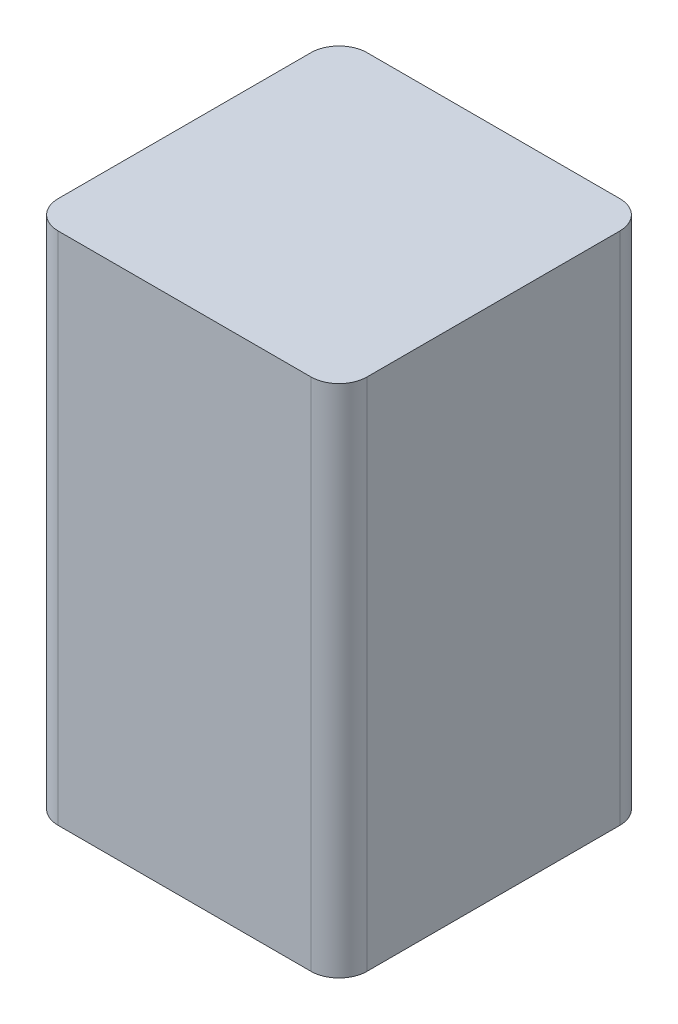
ISO-10303-21;
HEADER;
FILE_DESCRIPTION(('STEP AP214'),'2;1');
FILE_NAME('part.step','',(''),(''),'','','');
FILE_SCHEMA(('AUTOMOTIVE_DESIGN { 1 0 10303 214 1 1 1 1 }'));
ENDSEC;
DATA;
#1=APPLICATION_CONTEXT('core data for automotive mechanical design processes');
#2=APPLICATION_PROTOCOL_DEFINITION('international standard','automotive_design',2000,#1);
#3=PRODUCT_CONTEXT('',#1,'mechanical');
#4=PRODUCT('Part','Part','',(#3));
#5=PRODUCT_RELATED_PRODUCT_CATEGORY('part','',(#4));
#6=PRODUCT_DEFINITION_FORMATION('','',#4);
#7=PRODUCT_DEFINITION_CONTEXT('part definition',#1,'design');
#8=PRODUCT_DEFINITION('design','',#6,#7);
#9=PRODUCT_DEFINITION_SHAPE('','',#8);
#10=(LENGTH_UNIT() NAMED_UNIT(*) SI_UNIT(.MILLI.,.METRE.));
#11=(NAMED_UNIT(*) PLANE_ANGLE_UNIT() SI_UNIT($,.RADIAN.));
#12=(NAMED_UNIT(*) SI_UNIT($,.STERADIAN.) SOLID_ANGLE_UNIT());
#13=UNCERTAINTY_MEASURE_WITH_UNIT(LENGTH_MEASURE(1.E-05),#10,'distance_accuracy_value','');
#14=(GEOMETRIC_REPRESENTATION_CONTEXT(3) GLOBAL_UNCERTAINTY_ASSIGNED_CONTEXT((#13)) GLOBAL_UNIT_ASSIGNED_CONTEXT((#10,
#11,#12)) REPRESENTATION_CONTEXT('',''));
#15=CARTESIAN_POINT('',(0.,0.,0.));
#16=DIRECTION('',(0.,0.,1.));
#17=DIRECTION('',(1.,0.,0.));
#18=AXIS2_PLACEMENT_3D('',#15,#16,#17);
#19=CARTESIAN_POINT('',(16.5,55.,-16.5));
#20=DIRECTION('',(-1.,0.,0.));
#21=DIRECTION('',(0.,0.,1.));
#22=AXIS2_PLACEMENT_3D('',#19,#20,#21);
#23=PLANE('',#22);
#24=DIRECTION('',(0.,0.,-1.));
#25=VECTOR('',#24,1.);
#26=CARTESIAN_POINT('',(16.5,0.,-16.5));
#27=LINE('',#26,#25);
#28=CARTESIAN_POINT('',(16.5,0.,13.5));
#29=VERTEX_POINT('',#28);
#30=CARTESIAN_POINT('',(16.5,0.,-13.5));
#31=VERTEX_POINT('',#30);
#32=EDGE_CURVE('E130',#29,#31,#27,.T.);
#33=ORIENTED_EDGE('',*,*,#32,.T.);
#34=DIRECTION('',(0.,-1.,0.));
#35=VECTOR('',#34,1.);
#36=CARTESIAN_POINT('',(16.5,55.,-13.5));
#37=LINE('',#36,#35);
#38=CARTESIAN_POINT('',(16.5,55.,-13.5));
#39=VERTEX_POINT('',#38);
#40=EDGE_CURVE('E153',#31,#39,#37,.F.);
#41=ORIENTED_EDGE('',*,*,#40,.T.);
#42=DIRECTION('',(0.,0.,-1.));
#43=VECTOR('',#42,1.);
#44=CARTESIAN_POINT('',(16.5,55.,-16.5));
#45=LINE('',#44,#43);
#46=CARTESIAN_POINT('',(16.5,55.,13.5));
#47=VERTEX_POINT('',#46);
#48=EDGE_CURVE('E128',#47,#39,#45,.T.);
#49=ORIENTED_EDGE('',*,*,#48,.F.);
#50=DIRECTION('',(0.,-1.,0.));
#51=VECTOR('',#50,1.);
#52=CARTESIAN_POINT('',(16.5,55.,13.5));
#53=LINE('',#52,#51);
#54=EDGE_CURVE('E150',#47,#29,#53,.T.);
#55=ORIENTED_EDGE('',*,*,#54,.T.);
#56=EDGE_LOOP('',(#33,#41,#49,#55));
#57=FACE_BOUND('',#56,.T.);
#58=ADVANCED_FACE('F35',(#57),#23,.F.);
#59=CARTESIAN_POINT('',(-16.5,55.,-16.5));
#60=DIRECTION('',(0.,0.,1.));
#61=DIRECTION('',(1.,0.,0.));
#62=AXIS2_PLACEMENT_3D('',#59,#60,#61);
#63=PLANE('',#62);
#64=DIRECTION('',(-1.,0.,0.));
#65=VECTOR('',#64,1.);
#66=CARTESIAN_POINT('',(-16.5,0.,-16.5));
#67=LINE('',#66,#65);
#68=CARTESIAN_POINT('',(13.5,0.,-16.5));
#69=VERTEX_POINT('',#68);
#70=CARTESIAN_POINT('',(-13.5,0.,-16.5));
#71=VERTEX_POINT('',#70);
#72=EDGE_CURVE('E126',#69,#71,#67,.T.);
#73=ORIENTED_EDGE('',*,*,#72,.T.);
#74=DIRECTION('',(0.,-1.,0.));
#75=VECTOR('',#74,1.);
#76=CARTESIAN_POINT('',(-13.5,55.,-16.5));
#77=LINE('',#76,#75);
#78=CARTESIAN_POINT('',(-13.5,55.,-16.5));
#79=VERTEX_POINT('',#78);
#80=EDGE_CURVE('E105',#71,#79,#77,.F.);
#81=ORIENTED_EDGE('',*,*,#80,.T.);
#82=DIRECTION('',(-1.,0.,0.));
#83=VECTOR('',#82,1.);
#84=CARTESIAN_POINT('',(-16.5,55.,-16.5));
#85=LINE('',#84,#83);
#86=CARTESIAN_POINT('',(13.5,55.,-16.5));
#87=VERTEX_POINT('',#86);
#88=EDGE_CURVE('E169',#87,#79,#85,.T.);
#89=ORIENTED_EDGE('',*,*,#88,.F.);
#90=DIRECTION('',(0.,-1.,0.));
#91=VECTOR('',#90,1.);
#92=CARTESIAN_POINT('',(13.5,55.,-16.5));
#93=LINE('',#92,#91);
#94=EDGE_CURVE('E110',#87,#69,#93,.T.);
#95=ORIENTED_EDGE('',*,*,#94,.T.);
#96=EDGE_LOOP('',(#73,#81,#89,#95));
#97=FACE_BOUND('',#96,.T.);
#98=ADVANCED_FACE('F186',(#97),#63,.F.);
#99=CARTESIAN_POINT('',(-16.5,55.,-16.5));
#100=DIRECTION('',(1.,0.,0.));
#101=DIRECTION('',(0.,0.,-1.));
#102=AXIS2_PLACEMENT_3D('',#99,#100,#101);
#103=PLANE('',#102);
#104=DIRECTION('',(0.,0.,1.));
#105=VECTOR('',#104,1.);
#106=CARTESIAN_POINT('',(-16.5,55.,-16.5));
#107=LINE('',#106,#105);
#108=CARTESIAN_POINT('',(-16.5,55.,-13.5));
#109=VERTEX_POINT('',#108);
#110=CARTESIAN_POINT('',(-16.5,55.,13.5));
#111=VERTEX_POINT('',#110);
#112=EDGE_CURVE('E119',#109,#111,#107,.T.);
#113=ORIENTED_EDGE('',*,*,#112,.F.);
#114=DIRECTION('',(0.,-1.,0.));
#115=VECTOR('',#114,1.);
#116=CARTESIAN_POINT('',(-16.5,55.,-13.5));
#117=LINE('',#116,#115);
#118=CARTESIAN_POINT('',(-16.5,0.,-13.5));
#119=VERTEX_POINT('',#118);
#120=EDGE_CURVE('E104',#109,#119,#117,.T.);
#121=ORIENTED_EDGE('',*,*,#120,.T.);
#122=DIRECTION('',(0.,0.,1.));
#123=VECTOR('',#122,1.);
#124=CARTESIAN_POINT('',(-16.5,0.,-16.5));
#125=LINE('',#124,#123);
#126=CARTESIAN_POINT('',(-16.5,0.,13.5));
#127=VERTEX_POINT('',#126);
#128=EDGE_CURVE('E117',#119,#127,#125,.T.);
#129=ORIENTED_EDGE('',*,*,#128,.T.);
#130=DIRECTION('',(0.,-1.,0.));
#131=VECTOR('',#130,1.);
#132=CARTESIAN_POINT('',(-16.5,55.,13.5));
#133=LINE('',#132,#131);
#134=EDGE_CURVE('E121',#127,#111,#133,.F.);
#135=ORIENTED_EDGE('',*,*,#134,.T.);
#136=EDGE_LOOP('',(#113,#121,#129,#135));
#137=FACE_BOUND('',#136,.T.);
#138=ADVANCED_FACE('F116',(#137),#103,.F.);
#139=CARTESIAN_POINT('',(-16.5,55.,16.5));
#140=DIRECTION('',(0.,0.,-1.));
#141=DIRECTION('',(-1.,0.,0.));
#142=AXIS2_PLACEMENT_3D('',#139,#140,#141);
#143=PLANE('',#142);
#144=DIRECTION('',(1.,0.,0.));
#145=VECTOR('',#144,1.);
#146=CARTESIAN_POINT('',(-16.5,0.,16.5));
#147=LINE('',#146,#145);
#148=CARTESIAN_POINT('',(-13.5,0.,16.5));
#149=VERTEX_POINT('',#148);
#150=CARTESIAN_POINT('',(13.5,0.,16.5));
#151=VERTEX_POINT('',#150);
#152=EDGE_CURVE('E125',#149,#151,#147,.T.);
#153=ORIENTED_EDGE('',*,*,#152,.T.);
#154=DIRECTION('',(0.,-1.,0.));
#155=VECTOR('',#154,1.);
#156=CARTESIAN_POINT('',(13.5,55.,16.5));
#157=LINE('',#156,#155);
#158=CARTESIAN_POINT('',(13.5,55.,16.5));
#159=VERTEX_POINT('',#158);
#160=EDGE_CURVE('E11',#151,#159,#157,.F.);
#161=ORIENTED_EDGE('',*,*,#160,.T.);
#162=DIRECTION('',(1.,0.,0.));
#163=VECTOR('',#162,1.);
#164=CARTESIAN_POINT('',(-16.5,55.,16.5));
#165=LINE('',#164,#163);
#166=CARTESIAN_POINT('',(-13.5,55.,16.5));
#167=VERTEX_POINT('',#166);
#168=EDGE_CURVE('E134',#167,#159,#165,.T.);
#169=ORIENTED_EDGE('',*,*,#168,.F.);
#170=DIRECTION('',(0.,-1.,0.));
#171=VECTOR('',#170,1.);
#172=CARTESIAN_POINT('',(-13.5,55.,16.5));
#173=LINE('',#172,#171);
#174=EDGE_CURVE('E43',#167,#149,#173,.T.);
#175=ORIENTED_EDGE('',*,*,#174,.T.);
#176=EDGE_LOOP('',(#153,#161,#169,#175));
#177=FACE_BOUND('',#176,.T.);
#178=ADVANCED_FACE('F156',(#177),#143,.F.);
#179=CARTESIAN_POINT('',(0.,55.,0.));
#180=DIRECTION('',(0.,1.,0.));
#181=DIRECTION('',(0.,0.,1.));
#182=AXIS2_PLACEMENT_3D('',#179,#180,#181);
#183=PLANE('',#182);
#184=ORIENTED_EDGE('',*,*,#88,.T.);
#185=CARTESIAN_POINT('',(-13.5,55.,-13.5));
#186=DIRECTION('',(0.,1.,0.));
#187=DIRECTION('',(0.,0.,1.));
#188=AXIS2_PLACEMENT_3D('',#185,#186,#187);
#189=CIRCLE('',#188,3.);
#190=EDGE_CURVE('E148',#79,#109,#189,.T.);
#191=ORIENTED_EDGE('',*,*,#190,.T.);
#192=ORIENTED_EDGE('',*,*,#112,.T.);
#193=CARTESIAN_POINT('',(-13.5,55.,13.5));
#194=DIRECTION('',(0.,1.,0.));
#195=DIRECTION('',(0.,0.,1.));
#196=AXIS2_PLACEMENT_3D('',#193,#194,#195);
#197=CIRCLE('',#196,3.);
#198=EDGE_CURVE('E55',#111,#167,#197,.T.);
#199=ORIENTED_EDGE('',*,*,#198,.T.);
#200=ORIENTED_EDGE('',*,*,#168,.T.);
#201=CARTESIAN_POINT('',(13.5,55.,13.5));
#202=DIRECTION('',(0.,1.,0.));
#203=DIRECTION('',(0.,0.,1.));
#204=AXIS2_PLACEMENT_3D('',#201,#202,#203);
#205=CIRCLE('',#204,3.);
#206=EDGE_CURVE('E144',#159,#47,#205,.T.);
#207=ORIENTED_EDGE('',*,*,#206,.T.);
#208=ORIENTED_EDGE('',*,*,#48,.T.);
#209=CARTESIAN_POINT('',(13.5,55.,-13.5));
#210=DIRECTION('',(0.,1.,0.));
#211=DIRECTION('',(0.,0.,1.));
#212=AXIS2_PLACEMENT_3D('',#209,#210,#211);
#213=CIRCLE('',#212,3.);
#214=EDGE_CURVE('E146',#39,#87,#213,.T.);
#215=ORIENTED_EDGE('',*,*,#214,.T.);
#216=EDGE_LOOP('',(#184,#191,#192,#199,#200,#207,#208,#215));
#217=FACE_BOUND('',#216,.T.);
#218=ADVANCED_FACE('F175',(#217),#183,.T.);
#219=CARTESIAN_POINT('',(0.,0.,0.));
#220=DIRECTION('',(0.,1.,0.));
#221=DIRECTION('',(0.,0.,1.));
#222=AXIS2_PLACEMENT_3D('',#219,#220,#221);
#223=PLANE('',#222);
#224=ORIENTED_EDGE('',*,*,#128,.F.);
#225=CARTESIAN_POINT('',(-13.5,0.,-13.5));
#226=DIRECTION('',(0.,1.,0.));
#227=DIRECTION('',(0.,0.,1.));
#228=AXIS2_PLACEMENT_3D('',#225,#226,#227);
#229=CIRCLE('',#228,3.);
#230=EDGE_CURVE('E100',#119,#71,#229,.F.);
#231=ORIENTED_EDGE('',*,*,#230,.T.);
#232=ORIENTED_EDGE('',*,*,#72,.F.);
#233=CARTESIAN_POINT('',(13.5,0.,-13.5));
#234=DIRECTION('',(0.,1.,0.));
#235=DIRECTION('',(0.,0.,1.));
#236=AXIS2_PLACEMENT_3D('',#233,#234,#235);
#237=CIRCLE('',#236,3.);
#238=EDGE_CURVE('E111',#69,#31,#237,.F.);
#239=ORIENTED_EDGE('',*,*,#238,.T.);
#240=ORIENTED_EDGE('',*,*,#32,.F.);
#241=CARTESIAN_POINT('',(13.5,0.,13.5));
#242=DIRECTION('',(0.,1.,0.));
#243=DIRECTION('',(0.,0.,1.));
#244=AXIS2_PLACEMENT_3D('',#241,#242,#243);
#245=CIRCLE('',#244,3.);
#246=EDGE_CURVE('E137',#29,#151,#245,.F.);
#247=ORIENTED_EDGE('',*,*,#246,.T.);
#248=ORIENTED_EDGE('',*,*,#152,.F.);
#249=CARTESIAN_POINT('',(-13.5,0.,13.5));
#250=DIRECTION('',(0.,1.,0.));
#251=DIRECTION('',(0.,0.,1.));
#252=AXIS2_PLACEMENT_3D('',#249,#250,#251);
#253=CIRCLE('',#252,3.);
#254=EDGE_CURVE('E120',#149,#127,#253,.F.);
#255=ORIENTED_EDGE('',*,*,#254,.T.);
#256=EDGE_LOOP('',(#224,#231,#232,#239,#240,#247,#248,#255));
#257=FACE_BOUND('',#256,.T.);
#258=ADVANCED_FACE('F123',(#257),#223,.F.);
#259=CARTESIAN_POINT('',(-13.5,55.,-13.5));
#260=DIRECTION('',(0.,-1.,0.));
#261=DIRECTION('',(0.,0.,-1.));
#262=AXIS2_PLACEMENT_3D('',#259,#260,#261);
#263=CYLINDRICAL_SURFACE('',#262,3.);
#264=ORIENTED_EDGE('',*,*,#190,.F.);
#265=ORIENTED_EDGE('',*,*,#80,.F.);
#266=ORIENTED_EDGE('',*,*,#230,.F.);
#267=ORIENTED_EDGE('',*,*,#120,.F.);
#268=EDGE_LOOP('',(#264,#265,#266,#267));
#269=FACE_BOUND('',#268,.T.);
#270=ADVANCED_FACE('F103',(#269),#263,.T.);
#271=CARTESIAN_POINT('',(13.5,55.,-13.5));
#272=DIRECTION('',(0.,-1.,0.));
#273=DIRECTION('',(0.,0.,-1.));
#274=AXIS2_PLACEMENT_3D('',#271,#272,#273);
#275=CYLINDRICAL_SURFACE('',#274,3.);
#276=ORIENTED_EDGE('',*,*,#214,.F.);
#277=ORIENTED_EDGE('',*,*,#40,.F.);
#278=ORIENTED_EDGE('',*,*,#238,.F.);
#279=ORIENTED_EDGE('',*,*,#94,.F.);
#280=EDGE_LOOP('',(#276,#277,#278,#279));
#281=FACE_BOUND('',#280,.T.);
#282=ADVANCED_FACE('F197',(#281),#275,.T.);
#283=CARTESIAN_POINT('',(13.5,55.,13.5));
#284=DIRECTION('',(0.,-1.,0.));
#285=DIRECTION('',(0.,0.,-1.));
#286=AXIS2_PLACEMENT_3D('',#283,#284,#285);
#287=CYLINDRICAL_SURFACE('',#286,3.);
#288=ORIENTED_EDGE('',*,*,#206,.F.);
#289=ORIENTED_EDGE('',*,*,#160,.F.);
#290=ORIENTED_EDGE('',*,*,#246,.F.);
#291=ORIENTED_EDGE('',*,*,#54,.F.);
#292=EDGE_LOOP('',(#288,#289,#290,#291));
#293=FACE_BOUND('',#292,.T.);
#294=ADVANCED_FACE('F163',(#293),#287,.T.);
#295=CARTESIAN_POINT('',(-13.5,55.,13.5));
#296=DIRECTION('',(0.,-1.,0.));
#297=DIRECTION('',(0.,0.,-1.));
#298=AXIS2_PLACEMENT_3D('',#295,#296,#297);
#299=CYLINDRICAL_SURFACE('',#298,3.);
#300=ORIENTED_EDGE('',*,*,#198,.F.);
#301=ORIENTED_EDGE('',*,*,#134,.F.);
#302=ORIENTED_EDGE('',*,*,#254,.F.);
#303=ORIENTED_EDGE('',*,*,#174,.F.);
#304=EDGE_LOOP('',(#300,#301,#302,#303));
#305=FACE_BOUND('',#304,.T.);
#306=ADVANCED_FACE('F37',(#305),#299,.T.);
#307=CLOSED_SHELL('',(#58,#98,#138,#178,#218,#258,#270,#282,#294,#306));
#308=MANIFOLD_SOLID_BREP('B2',#307);
#309=ADVANCED_BREP_SHAPE_REPRESENTATION('',(#18,#308),#14);
#310=SHAPE_DEFINITION_REPRESENTATION(#9,#309);
ENDSEC;
END-ISO-10303-21;
